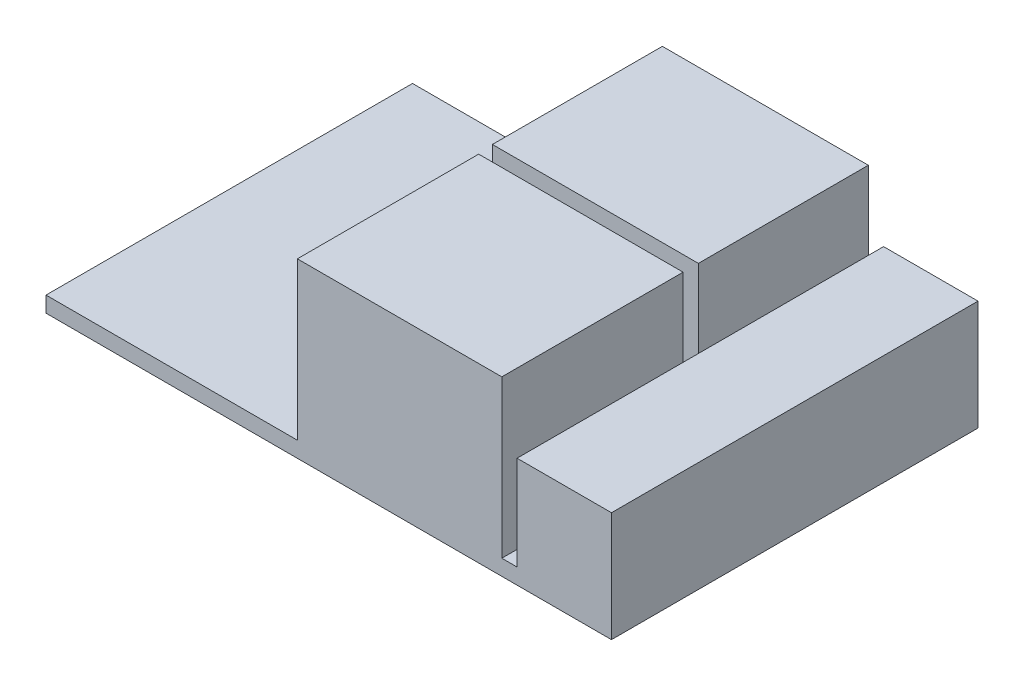
ISO-10303-21;
HEADER;
FILE_DESCRIPTION(('STEP AP214'),'2;1');
FILE_NAME('part.step','',(''),(''),'','','');
FILE_SCHEMA(('AUTOMOTIVE_DESIGN { 1 0 10303 214 1 1 1 1 }'));
ENDSEC;
DATA;
#1=APPLICATION_CONTEXT('core data for automotive mechanical design processes');
#2=APPLICATION_PROTOCOL_DEFINITION('international standard','automotive_design',2000,#1);
#3=PRODUCT_CONTEXT('',#1,'mechanical');
#4=PRODUCT('Part','Part','',(#3));
#5=PRODUCT_RELATED_PRODUCT_CATEGORY('part','',(#4));
#6=PRODUCT_DEFINITION_FORMATION('','',#4);
#7=PRODUCT_DEFINITION_CONTEXT('part definition',#1,'design');
#8=PRODUCT_DEFINITION('design','',#6,#7);
#9=PRODUCT_DEFINITION_SHAPE('','',#8);
#10=(LENGTH_UNIT() NAMED_UNIT(*) SI_UNIT(.MILLI.,.METRE.));
#11=(NAMED_UNIT(*) PLANE_ANGLE_UNIT() SI_UNIT($,.RADIAN.));
#12=(NAMED_UNIT(*) SI_UNIT($,.STERADIAN.) SOLID_ANGLE_UNIT());
#13=UNCERTAINTY_MEASURE_WITH_UNIT(LENGTH_MEASURE(1.E-05),#10,'distance_accuracy_value','');
#14=(GEOMETRIC_REPRESENTATION_CONTEXT(3) GLOBAL_UNCERTAINTY_ASSIGNED_CONTEXT((#13)) GLOBAL_UNIT_ASSIGNED_CONTEXT((#10,
#11,#12)) REPRESENTATION_CONTEXT('',''));
#15=CARTESIAN_POINT('',(0.,0.,0.));
#16=DIRECTION('',(0.,0.,1.));
#17=DIRECTION('',(1.,0.,0.));
#18=AXIS2_PLACEMENT_3D('',#15,#16,#17);
#19=CARTESIAN_POINT('',(0.,1.5,0.));
#20=DIRECTION('',(0.,1.,0.));
#21=DIRECTION('',(0.,0.,1.));
#22=AXIS2_PLACEMENT_3D('',#19,#20,#21);
#23=PLANE('',#22);
#24=DIRECTION('',(1.,0.,0.));
#25=VECTOR('',#24,1.);
#26=CARTESIAN_POINT('',(0.,1.5,-102.107926305811));
#27=LINE('',#26,#25);
#28=CARTESIAN_POINT('',(0.,1.5,-102.107926305811));
#29=VERTEX_POINT('',#28);
#30=CARTESIAN_POINT('',(24.0043678805869,1.5,-102.107926305811));
#31=VERTEX_POINT('',#30);
#32=EDGE_CURVE('E226',#29,#31,#27,.T.);
#33=ORIENTED_EDGE('',*,*,#32,.T.);
#34=DIRECTION('',(0.,0.,1.));
#35=VECTOR('',#34,1.);
#36=CARTESIAN_POINT('',(24.0043678805869,1.5,-119.420917765997));
#37=LINE('',#36,#35);
#38=CARTESIAN_POINT('',(24.0043678805869,1.5,-119.420917765997));
#39=VERTEX_POINT('',#38);
#40=EDGE_CURVE('E55',#39,#31,#37,.T.);
#41=ORIENTED_EDGE('',*,*,#40,.F.);
#42=DIRECTION('',(-1.,0.,0.));
#43=VECTOR('',#42,1.);
#44=CARTESIAN_POINT('',(24.0043678805869,1.5,-119.420917765997));
#45=LINE('',#44,#43);
#46=CARTESIAN_POINT('',(43.5269952613909,1.5,-119.420917765997));
#47=VERTEX_POINT('',#46);
#48=EDGE_CURVE('E50',#47,#39,#45,.T.);
#49=ORIENTED_EDGE('',*,*,#48,.F.);
#50=DIRECTION('',(0.,0.,-1.));
#51=VECTOR('',#50,1.);
#52=CARTESIAN_POINT('',(43.5269952613909,1.5,-119.420917765997));
#53=LINE('',#52,#51);
#54=CARTESIAN_POINT('',(43.5269952613909,1.5,-102.107926305811));
#55=VERTEX_POINT('',#54);
#56=EDGE_CURVE('E140',#55,#47,#53,.T.);
#57=ORIENTED_EDGE('',*,*,#56,.F.);
#58=CARTESIAN_POINT('',(44.9839077524957,1.5,-102.107926305811));
#59=VERTEX_POINT('',#58);
#60=EDGE_CURVE('E225',#55,#59,#27,.T.);
#61=ORIENTED_EDGE('',*,*,#60,.T.);
#62=DIRECTION('',(0.,0.,1.));
#63=VECTOR('',#62,1.);
#64=CARTESIAN_POINT('',(44.9839077524957,1.5,-137.107926305811));
#65=LINE('',#64,#63);
#66=CARTESIAN_POINT('',(44.9839077524957,1.5,-137.107926305811));
#67=VERTEX_POINT('',#66);
#68=EDGE_CURVE('E199',#67,#59,#65,.T.);
#69=ORIENTED_EDGE('',*,*,#68,.F.);
#70=DIRECTION('',(1.,0.,0.));
#71=VECTOR('',#70,1.);
#72=CARTESIAN_POINT('',(0.,1.5,-137.107926305811));
#73=LINE('',#72,#71);
#74=CARTESIAN_POINT('',(43.5269952613909,1.5,-137.107926305811));
#75=VERTEX_POINT('',#74);
#76=EDGE_CURVE('E223',#75,#67,#73,.T.);
#77=ORIENTED_EDGE('',*,*,#76,.F.);
#78=DIRECTION('',(0.,0.,-1.));
#79=VECTOR('',#78,1.);
#80=CARTESIAN_POINT('',(43.5269952613909,1.5,-137.107926305811));
#81=LINE('',#80,#79);
#82=CARTESIAN_POINT('',(43.5269952613909,1.5,-120.877830257102));
#83=VERTEX_POINT('',#82);
#84=EDGE_CURVE('E187',#83,#75,#81,.T.);
#85=ORIENTED_EDGE('',*,*,#84,.F.);
#86=DIRECTION('',(1.,0.,0.));
#87=VECTOR('',#86,1.);
#88=CARTESIAN_POINT('',(23.8586766314765,1.5,-120.877830257102));
#89=LINE('',#88,#87);
#90=CARTESIAN_POINT('',(23.8586766314765,1.5,-120.877830257102));
#91=VERTEX_POINT('',#90);
#92=EDGE_CURVE('E185',#91,#83,#89,.T.);
#93=ORIENTED_EDGE('',*,*,#92,.F.);
#94=DIRECTION('',(0.,0.,1.));
#95=VECTOR('',#94,1.);
#96=CARTESIAN_POINT('',(23.8586766314765,1.5,-137.107926305811));
#97=LINE('',#96,#95);
#98=CARTESIAN_POINT('',(23.8586766314765,1.5,-137.107926305811));
#99=VERTEX_POINT('',#98);
#100=EDGE_CURVE('E182',#99,#91,#97,.T.);
#101=ORIENTED_EDGE('',*,*,#100,.F.);
#102=CARTESIAN_POINT('',(0.,1.5,-137.107926305811));
#103=VERTEX_POINT('',#102);
#104=EDGE_CURVE('E219',#103,#99,#73,.T.);
#105=ORIENTED_EDGE('',*,*,#104,.F.);
#106=DIRECTION('',(0.,0.,1.));
#107=VECTOR('',#106,1.);
#108=CARTESIAN_POINT('',(0.,1.5,0.));
#109=LINE('',#108,#107);
#110=EDGE_CURVE('E222',#103,#29,#109,.T.);
#111=ORIENTED_EDGE('',*,*,#110,.T.);
#112=EDGE_LOOP('',(#33,#41,#49,#57,#61,#69,#77,#85,#93,#101,#105,#111));
#113=FACE_BOUND('',#112,.T.);
#114=ADVANCED_FACE('F35',(#113),#23,.T.);
#115=CARTESIAN_POINT('',(54.,1.5,0.));
#116=DIRECTION('',(1.,0.,0.));
#117=DIRECTION('',(0.,0.,-1.));
#118=AXIS2_PLACEMENT_3D('',#115,#116,#117);
#119=PLANE('',#118);
#120=DIRECTION('',(0.,0.,1.));
#121=VECTOR('',#120,1.);
#122=CARTESIAN_POINT('',(54.,0.,0.));
#123=LINE('',#122,#121);
#124=CARTESIAN_POINT('',(54.,0.,-137.107926305811));
#125=VERTEX_POINT('',#124);
#126=CARTESIAN_POINT('',(54.,0.,-102.107926305811));
#127=VERTEX_POINT('',#126);
#128=EDGE_CURVE('E218',#125,#127,#123,.T.);
#129=ORIENTED_EDGE('',*,*,#128,.F.);
#130=DIRECTION('',(0.,-1.,0.));
#131=VECTOR('',#130,1.);
#132=CARTESIAN_POINT('',(54.,1.5,-137.107926305811));
#133=LINE('',#132,#131);
#134=CARTESIAN_POINT('',(54.,10.5,-137.107926305811));
#135=VERTEX_POINT('',#134);
#136=EDGE_CURVE('E11',#135,#125,#133,.T.);
#137=ORIENTED_EDGE('',*,*,#136,.F.);
#138=DIRECTION('',(0.,0.,-1.));
#139=VECTOR('',#138,1.);
#140=CARTESIAN_POINT('',(54.,10.5,-137.107926305811));
#141=LINE('',#140,#139);
#142=CARTESIAN_POINT('',(54.,10.5,-102.107926305811));
#143=VERTEX_POINT('',#142);
#144=EDGE_CURVE('E200',#143,#135,#141,.T.);
#145=ORIENTED_EDGE('',*,*,#144,.F.);
#146=DIRECTION('',(0.,-1.,0.));
#147=VECTOR('',#146,1.);
#148=CARTESIAN_POINT('',(54.,1.5,-102.107926305811));
#149=LINE('',#148,#147);
#150=EDGE_CURVE('E228',#143,#127,#149,.T.);
#151=ORIENTED_EDGE('',*,*,#150,.T.);
#152=EDGE_LOOP('',(#129,#137,#145,#151));
#153=FACE_BOUND('',#152,.T.);
#154=ADVANCED_FACE('F37',(#153),#119,.T.);
#155=CARTESIAN_POINT('',(0.,1.5,-137.107926305811));
#156=DIRECTION('',(0.,0.,-1.));
#157=DIRECTION('',(-1.,0.,0.));
#158=AXIS2_PLACEMENT_3D('',#155,#156,#157);
#159=PLANE('',#158);
#160=DIRECTION('',(1.,0.,0.));
#161=VECTOR('',#160,1.);
#162=CARTESIAN_POINT('',(0.,0.,-137.107926305811));
#163=LINE('',#162,#161);
#164=CARTESIAN_POINT('',(0.,0.,-137.107926305811));
#165=VERTEX_POINT('',#164);
#166=EDGE_CURVE('E231',#165,#125,#163,.T.);
#167=ORIENTED_EDGE('',*,*,#166,.F.);
#168=DIRECTION('',(0.,-1.,0.));
#169=VECTOR('',#168,1.);
#170=CARTESIAN_POINT('',(0.,1.5,-137.107926305811));
#171=LINE('',#170,#169);
#172=EDGE_CURVE('E43',#103,#165,#171,.T.);
#173=ORIENTED_EDGE('',*,*,#172,.F.);
#174=ORIENTED_EDGE('',*,*,#104,.T.);
#175=DIRECTION('',(0.,-1.,0.));
#176=VECTOR('',#175,1.);
#177=CARTESIAN_POINT('',(23.8586766314765,10.5,-137.107926305811));
#178=LINE('',#177,#176);
#179=CARTESIAN_POINT('',(23.8586766314765,16.5,-137.107926305811));
#180=VERTEX_POINT('',#179);
#181=EDGE_CURVE('E190',#180,#99,#178,.T.);
#182=ORIENTED_EDGE('',*,*,#181,.F.);
#183=DIRECTION('',(-1.,0.,0.));
#184=VECTOR('',#183,1.);
#185=CARTESIAN_POINT('',(23.8586766314765,16.5,-137.107926305811));
#186=LINE('',#185,#184);
#187=CARTESIAN_POINT('',(43.5269952613909,16.5,-137.107926305811));
#188=VERTEX_POINT('',#187);
#189=EDGE_CURVE('E171',#188,#180,#186,.T.);
#190=ORIENTED_EDGE('',*,*,#189,.F.);
#191=DIRECTION('',(0.,-1.,0.));
#192=VECTOR('',#191,1.);
#193=CARTESIAN_POINT('',(43.5269952613909,10.5,-137.107926305811));
#194=LINE('',#193,#192);
#195=EDGE_CURVE('E192',#188,#75,#194,.T.);
#196=ORIENTED_EDGE('',*,*,#195,.T.);
#197=ORIENTED_EDGE('',*,*,#76,.T.);
#198=DIRECTION('',(0.,-1.,0.));
#199=VECTOR('',#198,1.);
#200=CARTESIAN_POINT('',(44.9839077524957,10.5,-137.107926305811));
#201=LINE('',#200,#199);
#202=CARTESIAN_POINT('',(44.9839077524957,10.5,-137.107926305811));
#203=VERTEX_POINT('',#202);
#204=EDGE_CURVE('E215',#203,#67,#201,.T.);
#205=ORIENTED_EDGE('',*,*,#204,.F.);
#206=DIRECTION('',(-1.,0.,0.));
#207=VECTOR('',#206,1.);
#208=CARTESIAN_POINT('',(54.,10.5,-137.107926305811));
#209=LINE('',#208,#207);
#210=EDGE_CURVE('E203',#135,#203,#209,.T.);
#211=ORIENTED_EDGE('',*,*,#210,.F.);
#212=ORIENTED_EDGE('',*,*,#136,.T.);
#213=EDGE_LOOP('',(#167,#173,#174,#182,#190,#196,#197,#205,#211,#212));
#214=FACE_BOUND('',#213,.T.);
#215=ADVANCED_FACE('F253',(#214),#159,.T.);
#216=CARTESIAN_POINT('',(0.,1.5,0.));
#217=DIRECTION('',(1.,0.,0.));
#218=DIRECTION('',(0.,0.,-1.));
#219=AXIS2_PLACEMENT_3D('',#216,#217,#218);
#220=PLANE('',#219);
#221=DIRECTION('',(0.,0.,1.));
#222=VECTOR('',#221,1.);
#223=CARTESIAN_POINT('',(0.,0.,0.));
#224=LINE('',#223,#222);
#225=CARTESIAN_POINT('',(0.,0.,-102.107926305811));
#226=VERTEX_POINT('',#225);
#227=EDGE_CURVE('E234',#165,#226,#224,.T.);
#228=ORIENTED_EDGE('',*,*,#227,.T.);
#229=DIRECTION('',(0.,-1.,0.));
#230=VECTOR('',#229,1.);
#231=CARTESIAN_POINT('',(0.,1.5,-102.107926305811));
#232=LINE('',#231,#230);
#233=EDGE_CURVE('E240',#29,#226,#232,.T.);
#234=ORIENTED_EDGE('',*,*,#233,.F.);
#235=ORIENTED_EDGE('',*,*,#110,.F.);
#236=ORIENTED_EDGE('',*,*,#172,.T.);
#237=EDGE_LOOP('',(#228,#234,#235,#236));
#238=FACE_BOUND('',#237,.T.);
#239=ADVANCED_FACE('F245',(#238),#220,.F.);
#240=CARTESIAN_POINT('',(0.,1.5,-102.107926305811));
#241=DIRECTION('',(0.,0.,-1.));
#242=DIRECTION('',(-1.,0.,0.));
#243=AXIS2_PLACEMENT_3D('',#240,#241,#242);
#244=PLANE('',#243);
#245=DIRECTION('',(1.,0.,0.));
#246=VECTOR('',#245,1.);
#247=CARTESIAN_POINT('',(0.,0.,-102.107926305811));
#248=LINE('',#247,#246);
#249=EDGE_CURVE('E236',#226,#127,#248,.T.);
#250=ORIENTED_EDGE('',*,*,#249,.T.);
#251=ORIENTED_EDGE('',*,*,#150,.F.);
#252=DIRECTION('',(1.,0.,0.));
#253=VECTOR('',#252,1.);
#254=CARTESIAN_POINT('',(54.,10.5,-102.107926305811));
#255=LINE('',#254,#253);
#256=CARTESIAN_POINT('',(44.9839077524957,10.5,-102.107926305811));
#257=VERTEX_POINT('',#256);
#258=EDGE_CURVE('E207',#257,#143,#255,.T.);
#259=ORIENTED_EDGE('',*,*,#258,.F.);
#260=DIRECTION('',(0.,-1.,0.));
#261=VECTOR('',#260,1.);
#262=CARTESIAN_POINT('',(44.9839077524957,10.5,-102.107926305811));
#263=LINE('',#262,#261);
#264=EDGE_CURVE('E210',#257,#59,#263,.T.);
#265=ORIENTED_EDGE('',*,*,#264,.T.);
#266=ORIENTED_EDGE('',*,*,#60,.F.);
#267=DIRECTION('',(0.,-1.,0.));
#268=VECTOR('',#267,1.);
#269=CARTESIAN_POINT('',(43.5269952613909,10.5,-102.107926305811));
#270=LINE('',#269,#268);
#271=CARTESIAN_POINT('',(43.5269952613909,16.5,-102.107926305811));
#272=VERTEX_POINT('',#271);
#273=EDGE_CURVE('E142',#272,#55,#270,.T.);
#274=ORIENTED_EDGE('',*,*,#273,.F.);
#275=DIRECTION('',(1.,0.,0.));
#276=VECTOR('',#275,1.);
#277=CARTESIAN_POINT('',(43.5269952613909,16.5,-102.107926305811));
#278=LINE('',#277,#276);
#279=CARTESIAN_POINT('',(24.0043678805869,16.5,-102.107926305811));
#280=VERTEX_POINT('',#279);
#281=EDGE_CURVE('E157',#280,#272,#278,.T.);
#282=ORIENTED_EDGE('',*,*,#281,.F.);
#283=DIRECTION('',(0.,-1.,0.));
#284=VECTOR('',#283,1.);
#285=CARTESIAN_POINT('',(24.0043678805869,10.5,-102.107926305811));
#286=LINE('',#285,#284);
#287=EDGE_CURVE('E179',#280,#31,#286,.T.);
#288=ORIENTED_EDGE('',*,*,#287,.T.);
#289=ORIENTED_EDGE('',*,*,#32,.F.);
#290=ORIENTED_EDGE('',*,*,#233,.T.);
#291=EDGE_LOOP('',(#250,#251,#259,#265,#266,#274,#282,#288,#289,#290));
#292=FACE_BOUND('',#291,.T.);
#293=ADVANCED_FACE('F261',(#292),#244,.F.);
#294=CARTESIAN_POINT('',(0.,0.,0.));
#295=DIRECTION('',(0.,1.,0.));
#296=DIRECTION('',(0.,0.,1.));
#297=AXIS2_PLACEMENT_3D('',#294,#295,#296);
#298=PLANE('',#297);
#299=ORIENTED_EDGE('',*,*,#128,.T.);
#300=ORIENTED_EDGE('',*,*,#249,.F.);
#301=ORIENTED_EDGE('',*,*,#227,.F.);
#302=ORIENTED_EDGE('',*,*,#166,.T.);
#303=EDGE_LOOP('',(#299,#300,#301,#302));
#304=FACE_BOUND('',#303,.T.);
#305=ADVANCED_FACE('F252',(#304),#298,.F.);
#306=CARTESIAN_POINT('',(44.9839077524957,10.5,-137.107926305811));
#307=DIRECTION('',(1.,0.,0.));
#308=DIRECTION('',(0.,0.,-1.));
#309=AXIS2_PLACEMENT_3D('',#306,#307,#308);
#310=PLANE('',#309);
#311=ORIENTED_EDGE('',*,*,#68,.T.);
#312=ORIENTED_EDGE('',*,*,#264,.F.);
#313=DIRECTION('',(0.,0.,1.));
#314=VECTOR('',#313,1.);
#315=CARTESIAN_POINT('',(44.9839077524957,10.5,-137.107926305811));
#316=LINE('',#315,#314);
#317=EDGE_CURVE('E205',#203,#257,#316,.T.);
#318=ORIENTED_EDGE('',*,*,#317,.F.);
#319=ORIENTED_EDGE('',*,*,#204,.T.);
#320=EDGE_LOOP('',(#311,#312,#318,#319));
#321=FACE_BOUND('',#320,.T.);
#322=ADVANCED_FACE('F283',(#321),#310,.F.);
#323=CARTESIAN_POINT('',(0.,10.5,0.));
#324=DIRECTION('',(0.,-1.,0.));
#325=DIRECTION('',(0.,0.,-1.));
#326=AXIS2_PLACEMENT_3D('',#323,#324,#325);
#327=PLANE('',#326);
#328=ORIENTED_EDGE('',*,*,#144,.T.);
#329=ORIENTED_EDGE('',*,*,#210,.T.);
#330=ORIENTED_EDGE('',*,*,#317,.T.);
#331=ORIENTED_EDGE('',*,*,#258,.T.);
#332=EDGE_LOOP('',(#328,#329,#330,#331));
#333=FACE_BOUND('',#332,.T.);
#334=ADVANCED_FACE('F285',(#333),#327,.F.);
#335=CARTESIAN_POINT('',(23.8586766314765,10.5,-137.107926305811));
#336=DIRECTION('',(1.,0.,0.));
#337=DIRECTION('',(0.,0.,-1.));
#338=AXIS2_PLACEMENT_3D('',#335,#336,#337);
#339=PLANE('',#338);
#340=ORIENTED_EDGE('',*,*,#100,.T.);
#341=DIRECTION('',(0.,-1.,0.));
#342=VECTOR('',#341,1.);
#343=CARTESIAN_POINT('',(23.8586766314765,10.5,-120.877830257102));
#344=LINE('',#343,#342);
#345=CARTESIAN_POINT('',(23.8586766314765,16.5,-120.877830257102));
#346=VERTEX_POINT('',#345);
#347=EDGE_CURVE('E197',#346,#91,#344,.T.);
#348=ORIENTED_EDGE('',*,*,#347,.F.);
#349=DIRECTION('',(0.,0.,1.));
#350=VECTOR('',#349,1.);
#351=CARTESIAN_POINT('',(23.8586766314765,16.5,-137.107926305811));
#352=LINE('',#351,#350);
#353=EDGE_CURVE('E162',#180,#346,#352,.T.);
#354=ORIENTED_EDGE('',*,*,#353,.F.);
#355=ORIENTED_EDGE('',*,*,#181,.T.);
#356=EDGE_LOOP('',(#340,#348,#354,#355));
#357=FACE_BOUND('',#356,.T.);
#358=ADVANCED_FACE('F271',(#357),#339,.F.);
#359=CARTESIAN_POINT('',(23.8586766314765,10.5,-120.877830257102));
#360=DIRECTION('',(0.,0.,-1.));
#361=DIRECTION('',(-1.,0.,0.));
#362=AXIS2_PLACEMENT_3D('',#359,#360,#361);
#363=PLANE('',#362);
#364=ORIENTED_EDGE('',*,*,#92,.T.);
#365=DIRECTION('',(0.,-1.,0.));
#366=VECTOR('',#365,1.);
#367=CARTESIAN_POINT('',(43.5269952613909,10.5,-120.877830257102));
#368=LINE('',#367,#366);
#369=CARTESIAN_POINT('',(43.5269952613909,16.5,-120.877830257102));
#370=VERTEX_POINT('',#369);
#371=EDGE_CURVE('E194',#370,#83,#368,.T.);
#372=ORIENTED_EDGE('',*,*,#371,.F.);
#373=DIRECTION('',(1.,0.,0.));
#374=VECTOR('',#373,1.);
#375=CARTESIAN_POINT('',(23.8586766314765,16.5,-120.877830257102));
#376=LINE('',#375,#374);
#377=EDGE_CURVE('E165',#346,#370,#376,.T.);
#378=ORIENTED_EDGE('',*,*,#377,.F.);
#379=ORIENTED_EDGE('',*,*,#347,.T.);
#380=EDGE_LOOP('',(#364,#372,#378,#379));
#381=FACE_BOUND('',#380,.T.);
#382=ADVANCED_FACE('F274',(#381),#363,.F.);
#383=CARTESIAN_POINT('',(43.5269952613909,10.5,-137.107926305811));
#384=DIRECTION('',(-1.,0.,0.));
#385=DIRECTION('',(0.,0.,1.));
#386=AXIS2_PLACEMENT_3D('',#383,#384,#385);
#387=PLANE('',#386);
#388=ORIENTED_EDGE('',*,*,#84,.T.);
#389=ORIENTED_EDGE('',*,*,#195,.F.);
#390=DIRECTION('',(0.,0.,-1.));
#391=VECTOR('',#390,1.);
#392=CARTESIAN_POINT('',(43.5269952613909,16.5,-137.107926305811));
#393=LINE('',#392,#391);
#394=EDGE_CURVE('E168',#370,#188,#393,.T.);
#395=ORIENTED_EDGE('',*,*,#394,.F.);
#396=ORIENTED_EDGE('',*,*,#371,.T.);
#397=EDGE_LOOP('',(#388,#389,#395,#396));
#398=FACE_BOUND('',#397,.T.);
#399=ADVANCED_FACE('F276',(#398),#387,.F.);
#400=CARTESIAN_POINT('',(24.0043678805869,10.5,-119.420917765997));
#401=DIRECTION('',(1.,0.,0.));
#402=DIRECTION('',(0.,0.,-1.));
#403=AXIS2_PLACEMENT_3D('',#400,#401,#402);
#404=PLANE('',#403);
#405=ORIENTED_EDGE('',*,*,#40,.T.);
#406=ORIENTED_EDGE('',*,*,#287,.F.);
#407=DIRECTION('',(0.,0.,1.));
#408=VECTOR('',#407,1.);
#409=CARTESIAN_POINT('',(24.0043678805869,16.5,-119.420917765997));
#410=LINE('',#409,#408);
#411=CARTESIAN_POINT('',(24.0043678805869,16.5,-119.420917765997));
#412=VERTEX_POINT('',#411);
#413=EDGE_CURVE('E152',#412,#280,#410,.T.);
#414=ORIENTED_EDGE('',*,*,#413,.F.);
#415=DIRECTION('',(0.,-1.,0.));
#416=VECTOR('',#415,1.);
#417=CARTESIAN_POINT('',(24.0043678805869,10.5,-119.420917765997));
#418=LINE('',#417,#416);
#419=EDGE_CURVE('E143',#412,#39,#418,.T.);
#420=ORIENTED_EDGE('',*,*,#419,.T.);
#421=EDGE_LOOP('',(#405,#406,#414,#420));
#422=FACE_BOUND('',#421,.T.);
#423=ADVANCED_FACE('F359',(#422),#404,.F.);
#424=CARTESIAN_POINT('',(43.5269952613909,10.5,-119.420917765997));
#425=DIRECTION('',(-1.,0.,0.));
#426=DIRECTION('',(0.,0.,1.));
#427=AXIS2_PLACEMENT_3D('',#424,#425,#426);
#428=PLANE('',#427);
#429=ORIENTED_EDGE('',*,*,#56,.T.);
#430=DIRECTION('',(0.,-1.,0.));
#431=VECTOR('',#430,1.);
#432=CARTESIAN_POINT('',(43.5269952613909,10.5,-119.420917765997));
#433=LINE('',#432,#431);
#434=CARTESIAN_POINT('',(43.5269952613909,16.5,-119.420917765997));
#435=VERTEX_POINT('',#434);
#436=EDGE_CURVE('E134',#435,#47,#433,.T.);
#437=ORIENTED_EDGE('',*,*,#436,.F.);
#438=DIRECTION('',(0.,0.,-1.));
#439=VECTOR('',#438,1.);
#440=CARTESIAN_POINT('',(43.5269952613909,16.5,-119.420917765997));
#441=LINE('',#440,#439);
#442=EDGE_CURVE('E139',#272,#435,#441,.T.);
#443=ORIENTED_EDGE('',*,*,#442,.F.);
#444=ORIENTED_EDGE('',*,*,#273,.T.);
#445=EDGE_LOOP('',(#429,#437,#443,#444));
#446=FACE_BOUND('',#445,.T.);
#447=ADVANCED_FACE('F136',(#446),#428,.F.);
#448=CARTESIAN_POINT('',(24.0043678805869,10.5,-119.420917765997));
#449=DIRECTION('',(0.,0.,1.));
#450=DIRECTION('',(1.,0.,0.));
#451=AXIS2_PLACEMENT_3D('',#448,#449,#450);
#452=PLANE('',#451);
#453=ORIENTED_EDGE('',*,*,#48,.T.);
#454=ORIENTED_EDGE('',*,*,#419,.F.);
#455=DIRECTION('',(-1.,0.,0.));
#456=VECTOR('',#455,1.);
#457=CARTESIAN_POINT('',(43.5269952613909,16.5,-119.420917765997));
#458=LINE('',#457,#456);
#459=EDGE_CURVE('E146',#435,#412,#458,.T.);
#460=ORIENTED_EDGE('',*,*,#459,.F.);
#461=ORIENTED_EDGE('',*,*,#436,.T.);
#462=EDGE_LOOP('',(#453,#454,#460,#461));
#463=FACE_BOUND('',#462,.T.);
#464=ADVANCED_FACE('F147',(#463),#452,.F.);
#465=CARTESIAN_POINT('',(0.,16.5,0.));
#466=DIRECTION('',(0.,1.,0.));
#467=DIRECTION('',(0.,0.,1.));
#468=AXIS2_PLACEMENT_3D('',#465,#466,#467);
#469=PLANE('',#468);
#470=ORIENTED_EDGE('',*,*,#353,.T.);
#471=ORIENTED_EDGE('',*,*,#377,.T.);
#472=ORIENTED_EDGE('',*,*,#394,.T.);
#473=ORIENTED_EDGE('',*,*,#189,.T.);
#474=EDGE_LOOP('',(#470,#471,#472,#473));
#475=FACE_BOUND('',#474,.T.);
#476=ADVANCED_FACE('F269',(#475),#469,.T.);
#477=CARTESIAN_POINT('',(0.,16.5,0.));
#478=DIRECTION('',(0.,-1.,0.));
#479=DIRECTION('',(0.,0.,-1.));
#480=AXIS2_PLACEMENT_3D('',#477,#478,#479);
#481=PLANE('',#480);
#482=ORIENTED_EDGE('',*,*,#442,.T.);
#483=ORIENTED_EDGE('',*,*,#459,.T.);
#484=ORIENTED_EDGE('',*,*,#413,.T.);
#485=ORIENTED_EDGE('',*,*,#281,.T.);
#486=EDGE_LOOP('',(#482,#483,#484,#485));
#487=FACE_BOUND('',#486,.T.);
#488=ADVANCED_FACE('F155',(#487),#481,.F.);
#489=CLOSED_SHELL('',(#114,#154,#215,#239,#293,#305,#322,#334,#358,#382,#399,#423,#447,#464,
#476,#488));
#490=MANIFOLD_SOLID_BREP('B2',#489);
#491=ADVANCED_BREP_SHAPE_REPRESENTATION('',(#18,#490),#14);
#492=SHAPE_DEFINITION_REPRESENTATION(#9,#491);
ENDSEC;
END-ISO-10303-21;
